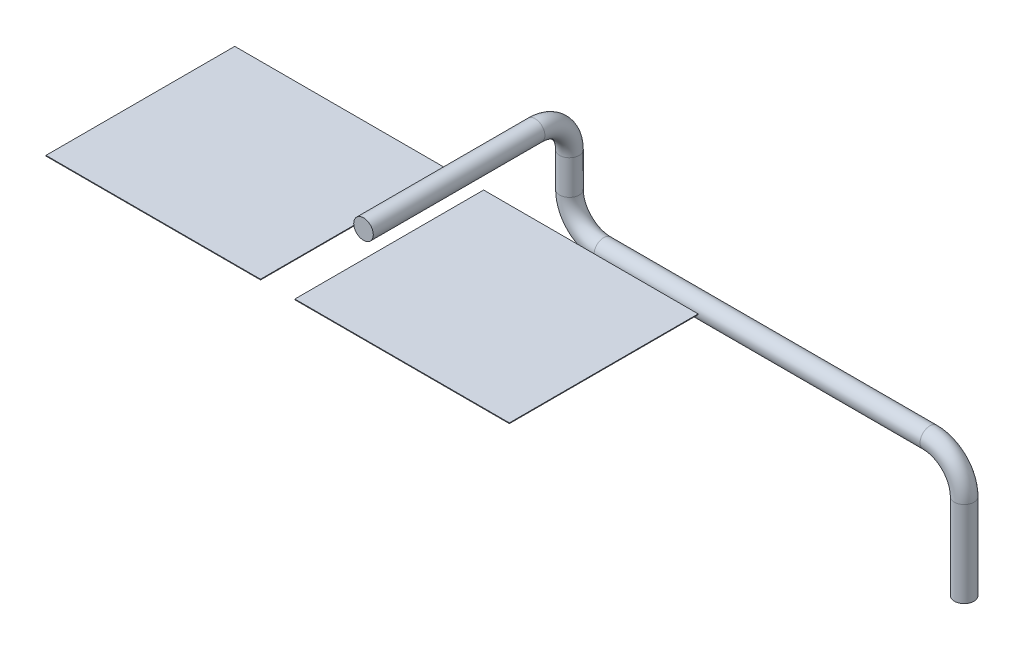
ISO-10303-21;
HEADER;
FILE_DESCRIPTION(('STEP AP214'),'2;1');
FILE_NAME('part.step','',(''),(''),'','','');
FILE_SCHEMA(('AUTOMOTIVE_DESIGN { 1 0 10303 214 1 1 1 1 }'));
ENDSEC;
DATA;
#1=APPLICATION_CONTEXT('core data for automotive mechanical design processes');
#2=APPLICATION_PROTOCOL_DEFINITION('international standard','automotive_design',2000,#1);
#3=PRODUCT_CONTEXT('',#1,'mechanical');
#4=PRODUCT('Part','Part','',(#3));
#5=PRODUCT_RELATED_PRODUCT_CATEGORY('part','',(#4));
#6=PRODUCT_DEFINITION_FORMATION('','',#4);
#7=PRODUCT_DEFINITION_CONTEXT('part definition',#1,'design');
#8=PRODUCT_DEFINITION('design','',#6,#7);
#9=PRODUCT_DEFINITION_SHAPE('','',#8);
#10=(LENGTH_UNIT() NAMED_UNIT(*) SI_UNIT(.MILLI.,.METRE.));
#11=(NAMED_UNIT(*) PLANE_ANGLE_UNIT() SI_UNIT($,.RADIAN.));
#12=(NAMED_UNIT(*) SI_UNIT($,.STERADIAN.) SOLID_ANGLE_UNIT());
#13=UNCERTAINTY_MEASURE_WITH_UNIT(LENGTH_MEASURE(1.E-05),#10,'distance_accuracy_value','');
#14=(GEOMETRIC_REPRESENTATION_CONTEXT(3) GLOBAL_UNCERTAINTY_ASSIGNED_CONTEXT((#13)) GLOBAL_UNIT_ASSIGNED_CONTEXT((#10,
#11,#12)) REPRESENTATION_CONTEXT('',''));
#15=CARTESIAN_POINT('',(0.,0.,0.));
#16=DIRECTION('',(0.,0.,1.));
#17=DIRECTION('',(1.,0.,0.));
#18=AXIS2_PLACEMENT_3D('',#15,#16,#17);
#19=CARTESIAN_POINT('',(13.5,0.57,-5.));
#20=DIRECTION('',(0.,0.,-1.));
#21=DIRECTION('',(-1.,0.,0.));
#22=AXIS2_PLACEMENT_3D('',#19,#20,#21);
#23=CYLINDRICAL_SURFACE('',#22,0.57);
#24=CARTESIAN_POINT('',(13.5,0.57,-5.));
#25=DIRECTION('',(0.,0.,-1.));
#26=DIRECTION('',(-1.,0.,0.));
#27=AXIS2_PLACEMENT_3D('',#24,#25,#26);
#28=CIRCLE('',#27,0.57);
#29=CARTESIAN_POINT('',(12.93,0.57,-5.));
#30=VERTEX_POINT('',#29);
#31=EDGE_CURVE('E12',#30,#30,#28,.T.);
#32=ORIENTED_EDGE('',*,*,#31,.T.);
#33=EDGE_LOOP('',(#32));
#34=FACE_BOUND('',#33,.T.);
#35=CARTESIAN_POINT('',(13.5,0.57,-15.));
#36=DIRECTION('',(0.,0.,-1.));
#37=DIRECTION('',(-1.,0.,0.));
#38=AXIS2_PLACEMENT_3D('',#35,#36,#37);
#39=CIRCLE('',#38,0.57);
#40=CARTESIAN_POINT('',(13.5,1.14,-15.));
#41=VERTEX_POINT('',#40);
#42=EDGE_CURVE('E75',#41,#41,#39,.T.);
#43=ORIENTED_EDGE('',*,*,#42,.F.);
#44=EDGE_LOOP('',(#43));
#45=FACE_BOUND('',#44,.T.);
#46=ADVANCED_FACE('F47',(#34,#45),#23,.T.);
#47=CARTESIAN_POINT('',(13.5,0.57,-5.));
#48=DIRECTION('',(0.,0.,-1.));
#49=DIRECTION('',(-1.,0.,0.));
#50=AXIS2_PLACEMENT_3D('',#47,#48,#49);
#51=PLANE('',#50);
#52=ORIENTED_EDGE('',*,*,#31,.F.);
#53=EDGE_LOOP('',(#52));
#54=FACE_BOUND('',#53,.T.);
#55=ADVANCED_FACE('F82',(#54),#51,.F.);
#56=CARTESIAN_POINT('',(36.5,-12.43,-17.));
#57=DIRECTION('',(0.,-1.,0.));
#58=DIRECTION('',(-1.,0.,0.));
#59=AXIS2_PLACEMENT_3D('',#56,#57,#58);
#60=PLANE('',#59);
#61=CARTESIAN_POINT('',(36.5,-12.43,-17.));
#62=DIRECTION('',(0.,-1.,0.));
#63=DIRECTION('',(-1.,0.,0.));
#64=AXIS2_PLACEMENT_3D('',#61,#62,#63);
#65=CIRCLE('',#64,0.57);
#66=CARTESIAN_POINT('',(35.93,-12.43,-17.));
#67=VERTEX_POINT('',#66);
#68=EDGE_CURVE('E53',#67,#67,#65,.T.);
#69=ORIENTED_EDGE('',*,*,#68,.T.);
#70=EDGE_LOOP('',(#69));
#71=FACE_BOUND('',#70,.T.);
#72=ADVANCED_FACE('F57',(#71),#60,.T.);
#73=CARTESIAN_POINT('',(13.5,-1.43,-15.));
#74=DIRECTION('',(-1.,0.,0.));
#75=DIRECTION('',(0.,0.,1.));
#76=AXIS2_PLACEMENT_3D('',#73,#74,#75);
#77=TOROIDAL_SURFACE('',#76,2.,0.57);
#78=CARTESIAN_POINT('',(13.5,-1.43,-17.));
#79=DIRECTION('',(0.,-1.,0.));
#80=DIRECTION('',(-1.,0.,0.));
#81=AXIS2_PLACEMENT_3D('',#78,#79,#80);
#82=CIRCLE('',#81,0.57);
#83=CARTESIAN_POINT('',(13.5,-1.43,-17.57));
#84=VERTEX_POINT('',#83);
#85=EDGE_CURVE('E72',#84,#84,#82,.T.);
#86=CARTESIAN_POINT('',(13.5,-1.43,-15.));
#87=DIRECTION('',(-1.,0.,0.));
#88=DIRECTION('',(0.,0.,1.));
#89=AXIS2_PLACEMENT_3D('',#86,#87,#88);
#90=CIRCLE('',#89,2.57);
#91=EDGE_CURVE('',#41,#84,#90,.T.);
#92=ORIENTED_EDGE('',*,*,#42,.T.);
#93=ORIENTED_EDGE('',*,*,#85,.F.);
#94=ORIENTED_EDGE('',*,*,#91,.T.);
#95=ORIENTED_EDGE('',*,*,#91,.F.);
#96=EDGE_LOOP('',(#92,#94,#93,#95));
#97=FACE_BOUND('',#96,.T.);
#98=ADVANCED_FACE('F79',(#97),#77,.T.);
#99=CARTESIAN_POINT('',(13.5,-1.43,-17.));
#100=DIRECTION('',(0.,-1.,0.));
#101=DIRECTION('',(0.,0.,-1.));
#102=AXIS2_PLACEMENT_3D('',#99,#100,#101);
#103=CYLINDRICAL_SURFACE('',#102,0.57);
#104=CARTESIAN_POINT('',(13.5,-3.43,-17.));
#105=DIRECTION('',(0.,-1.,0.));
#106=DIRECTION('',(-1.,0.,0.));
#107=AXIS2_PLACEMENT_3D('',#104,#105,#106);
#108=CIRCLE('',#107,0.57);
#109=CARTESIAN_POINT('',(12.93,-3.43,-17.));
#110=VERTEX_POINT('',#109);
#111=EDGE_CURVE('E69',#110,#110,#108,.T.);
#112=ORIENTED_EDGE('',*,*,#111,.F.);
#113=EDGE_LOOP('',(#112));
#114=FACE_BOUND('',#113,.T.);
#115=ORIENTED_EDGE('',*,*,#85,.T.);
#116=EDGE_LOOP('',(#115));
#117=FACE_BOUND('',#116,.T.);
#118=ADVANCED_FACE('F111',(#114,#117),#103,.T.);
#119=CARTESIAN_POINT('',(15.5,-3.43,-17.));
#120=DIRECTION('',(0.,0.,1.));
#121=DIRECTION('',(1.,0.,0.));
#122=AXIS2_PLACEMENT_3D('',#119,#120,#121);
#123=TOROIDAL_SURFACE('',#122,2.,0.57);
#124=CARTESIAN_POINT('',(15.5,-5.43,-17.));
#125=DIRECTION('',(1.,0.,0.));
#126=DIRECTION('',(0.,-1.,0.));
#127=AXIS2_PLACEMENT_3D('',#124,#125,#126);
#128=CIRCLE('',#127,0.57);
#129=CARTESIAN_POINT('',(15.5,-6.,-17.));
#130=VERTEX_POINT('',#129);
#131=EDGE_CURVE('E66',#130,#130,#128,.T.);
#132=CARTESIAN_POINT('',(15.5,-3.43,-17.));
#133=DIRECTION('',(0.,0.,1.));
#134=DIRECTION('',(1.,0.,0.));
#135=AXIS2_PLACEMENT_3D('',#132,#133,#134);
#136=CIRCLE('',#135,2.57);
#137=EDGE_CURVE('',#110,#130,#136,.T.);
#138=ORIENTED_EDGE('',*,*,#111,.T.);
#139=ORIENTED_EDGE('',*,*,#131,.F.);
#140=ORIENTED_EDGE('',*,*,#137,.T.);
#141=ORIENTED_EDGE('',*,*,#137,.F.);
#142=EDGE_LOOP('',(#138,#140,#139,#141));
#143=FACE_BOUND('',#142,.T.);
#144=ADVANCED_FACE('F107',(#143),#123,.T.);
#145=CARTESIAN_POINT('',(15.5,-5.43,-17.));
#146=DIRECTION('',(1.,0.,0.));
#147=DIRECTION('',(0.,0.,-1.));
#148=AXIS2_PLACEMENT_3D('',#145,#146,#147);
#149=CYLINDRICAL_SURFACE('',#148,0.57);
#150=CARTESIAN_POINT('',(34.5,-5.43,-17.));
#151=DIRECTION('',(1.,0.,0.));
#152=DIRECTION('',(0.,-1.,0.));
#153=AXIS2_PLACEMENT_3D('',#150,#151,#152);
#154=CIRCLE('',#153,0.57);
#155=CARTESIAN_POINT('',(34.5,-4.86,-17.));
#156=VERTEX_POINT('',#155);
#157=EDGE_CURVE('E61',#156,#156,#154,.T.);
#158=ORIENTED_EDGE('',*,*,#157,.F.);
#159=EDGE_LOOP('',(#158));
#160=FACE_BOUND('',#159,.T.);
#161=ORIENTED_EDGE('',*,*,#131,.T.);
#162=EDGE_LOOP('',(#161));
#163=FACE_BOUND('',#162,.T.);
#164=ADVANCED_FACE('F100',(#160,#163),#149,.T.);
#165=CARTESIAN_POINT('',(34.5,-7.43,-17.));
#166=DIRECTION('',(0.,0.,-1.));
#167=DIRECTION('',(-1.,0.,0.));
#168=AXIS2_PLACEMENT_3D('',#165,#166,#167);
#169=TOROIDAL_SURFACE('',#168,2.,0.57);
#170=CARTESIAN_POINT('',(36.5,-7.43,-17.));
#171=DIRECTION('',(0.,-1.,0.));
#172=DIRECTION('',(-1.,0.,0.));
#173=AXIS2_PLACEMENT_3D('',#170,#171,#172);
#174=CIRCLE('',#173,0.57);
#175=CARTESIAN_POINT('',(37.07,-7.43,-17.));
#176=VERTEX_POINT('',#175);
#177=EDGE_CURVE('E59',#176,#176,#174,.T.);
#178=CARTESIAN_POINT('',(34.5,-7.43,-17.));
#179=DIRECTION('',(0.,0.,-1.));
#180=DIRECTION('',(-1.,0.,0.));
#181=AXIS2_PLACEMENT_3D('',#178,#179,#180);
#182=CIRCLE('',#181,2.57);
#183=EDGE_CURVE('',#156,#176,#182,.T.);
#184=ORIENTED_EDGE('',*,*,#157,.T.);
#185=ORIENTED_EDGE('',*,*,#177,.F.);
#186=ORIENTED_EDGE('',*,*,#183,.T.);
#187=ORIENTED_EDGE('',*,*,#183,.F.);
#188=EDGE_LOOP('',(#184,#186,#185,#187));
#189=FACE_BOUND('',#188,.T.);
#190=ADVANCED_FACE('F95',(#189),#169,.T.);
#191=CARTESIAN_POINT('',(36.5,-7.43,-17.));
#192=DIRECTION('',(0.,-1.,0.));
#193=DIRECTION('',(0.,0.,-1.));
#194=AXIS2_PLACEMENT_3D('',#191,#192,#193);
#195=CYLINDRICAL_SURFACE('',#194,0.57);
#196=ORIENTED_EDGE('',*,*,#68,.F.);
#197=EDGE_LOOP('',(#196));
#198=FACE_BOUND('',#197,.T.);
#199=ORIENTED_EDGE('',*,*,#177,.T.);
#200=EDGE_LOOP('',(#199));
#201=FACE_BOUND('',#200,.T.);
#202=ADVANCED_FACE('F88',(#198,#201),#195,.T.);
#203=CLOSED_SHELL('',(#46,#55,#72,#98,#118,#144,#164,#190,#202));
#204=MANIFOLD_SOLID_BREP('B2',#203);
#205=CARTESIAN_POINT('',(14.5,0.04,0.));
#206=DIRECTION('',(1.,0.,0.));
#207=DIRECTION('',(0.,0.,-1.));
#208=AXIS2_PLACEMENT_3D('',#205,#206,#207);
#209=PLANE('',#208);
#210=DIRECTION('',(0.,0.,1.));
#211=VECTOR('',#210,1.);
#212=CARTESIAN_POINT('',(14.5,0.,0.));
#213=LINE('',#212,#211);
#214=CARTESIAN_POINT('',(14.5,0.,-11.));
#215=VERTEX_POINT('',#214);
#216=CARTESIAN_POINT('',(14.5,0.,0.));
#217=VERTEX_POINT('',#216);
#218=EDGE_CURVE('E255',#215,#217,#213,.T.);
#219=ORIENTED_EDGE('',*,*,#218,.T.);
#220=DIRECTION('',(0.,-1.,0.));
#221=VECTOR('',#220,1.);
#222=CARTESIAN_POINT('',(14.5,0.04,0.));
#223=LINE('',#222,#221);
#224=CARTESIAN_POINT('',(14.5,0.04,0.));
#225=VERTEX_POINT('',#224);
#226=EDGE_CURVE('E45',#225,#217,#223,.T.);
#227=ORIENTED_EDGE('',*,*,#226,.F.);
#228=DIRECTION('',(0.,0.,1.));
#229=VECTOR('',#228,1.);
#230=CARTESIAN_POINT('',(14.5,0.04,0.));
#231=LINE('',#230,#229);
#232=CARTESIAN_POINT('',(14.5,0.04,-11.));
#233=VERTEX_POINT('',#232);
#234=EDGE_CURVE('E243',#233,#225,#231,.T.);
#235=ORIENTED_EDGE('',*,*,#234,.F.);
#236=DIRECTION('',(0.,-1.,0.));
#237=VECTOR('',#236,1.);
#238=CARTESIAN_POINT('',(14.5,0.04,-11.));
#239=LINE('',#238,#237);
#240=EDGE_CURVE('E251',#233,#215,#239,.T.);
#241=ORIENTED_EDGE('',*,*,#240,.T.);
#242=EDGE_LOOP('',(#219,#227,#235,#241));
#243=FACE_BOUND('',#242,.T.);
#244=ADVANCED_FACE('F192',(#243),#209,.F.);
#245=CARTESIAN_POINT('',(14.5,0.04,0.));
#246=DIRECTION('',(0.,0.,-1.));
#247=DIRECTION('',(-1.,0.,0.));
#248=AXIS2_PLACEMENT_3D('',#245,#246,#247);
#249=PLANE('',#248);
#250=DIRECTION('',(1.,0.,0.));
#251=VECTOR('',#250,1.);
#252=CARTESIAN_POINT('',(14.5,0.,0.));
#253=LINE('',#252,#251);
#254=CARTESIAN_POINT('',(27.,0.,0.));
#255=VERTEX_POINT('',#254);
#256=EDGE_CURVE('E247',#217,#255,#253,.T.);
#257=ORIENTED_EDGE('',*,*,#256,.T.);
#258=DIRECTION('',(0.,-1.,0.));
#259=VECTOR('',#258,1.);
#260=CARTESIAN_POINT('',(27.,0.04,0.));
#261=LINE('',#260,#259);
#262=CARTESIAN_POINT('',(27.,0.04,0.));
#263=VERTEX_POINT('',#262);
#264=EDGE_CURVE('E200',#263,#255,#261,.T.);
#265=ORIENTED_EDGE('',*,*,#264,.F.);
#266=DIRECTION('',(1.,0.,0.));
#267=VECTOR('',#266,1.);
#268=CARTESIAN_POINT('',(14.5,0.04,0.));
#269=LINE('',#268,#267);
#270=EDGE_CURVE('E238',#225,#263,#269,.T.);
#271=ORIENTED_EDGE('',*,*,#270,.F.);
#272=ORIENTED_EDGE('',*,*,#226,.T.);
#273=EDGE_LOOP('',(#257,#265,#271,#272));
#274=FACE_BOUND('',#273,.T.);
#275=ADVANCED_FACE('F246',(#274),#249,.F.);
#276=CARTESIAN_POINT('',(27.,0.04,0.));
#277=DIRECTION('',(-1.,0.,0.));
#278=DIRECTION('',(0.,0.,1.));
#279=AXIS2_PLACEMENT_3D('',#276,#277,#278);
#280=PLANE('',#279);
#281=DIRECTION('',(0.,0.,-1.));
#282=VECTOR('',#281,1.);
#283=CARTESIAN_POINT('',(27.,0.,0.));
#284=LINE('',#283,#282);
#285=CARTESIAN_POINT('',(27.,0.,-11.));
#286=VERTEX_POINT('',#285);
#287=EDGE_CURVE('E225',#255,#286,#284,.T.);
#288=ORIENTED_EDGE('',*,*,#287,.T.);
#289=DIRECTION('',(0.,-1.,0.));
#290=VECTOR('',#289,1.);
#291=CARTESIAN_POINT('',(27.,0.04,-11.));
#292=LINE('',#291,#290);
#293=CARTESIAN_POINT('',(27.,0.04,-11.));
#294=VERTEX_POINT('',#293);
#295=EDGE_CURVE('E248',#294,#286,#292,.T.);
#296=ORIENTED_EDGE('',*,*,#295,.F.);
#297=DIRECTION('',(0.,0.,-1.));
#298=VECTOR('',#297,1.);
#299=CARTESIAN_POINT('',(27.,0.04,0.));
#300=LINE('',#299,#298);
#301=EDGE_CURVE('E241',#263,#294,#300,.T.);
#302=ORIENTED_EDGE('',*,*,#301,.F.);
#303=ORIENTED_EDGE('',*,*,#264,.T.);
#304=EDGE_LOOP('',(#288,#296,#302,#303));
#305=FACE_BOUND('',#304,.T.);
#306=ADVANCED_FACE('F249',(#305),#280,.F.);
#307=CARTESIAN_POINT('',(14.5,0.04,-11.));
#308=DIRECTION('',(0.,0.,1.));
#309=DIRECTION('',(1.,0.,0.));
#310=AXIS2_PLACEMENT_3D('',#307,#308,#309);
#311=PLANE('',#310);
#312=DIRECTION('',(-1.,0.,0.));
#313=VECTOR('',#312,1.);
#314=CARTESIAN_POINT('',(14.5,0.,-11.));
#315=LINE('',#314,#313);
#316=EDGE_CURVE('E231',#286,#215,#315,.T.);
#317=ORIENTED_EDGE('',*,*,#316,.T.);
#318=ORIENTED_EDGE('',*,*,#240,.F.);
#319=DIRECTION('',(-1.,0.,0.));
#320=VECTOR('',#319,1.);
#321=CARTESIAN_POINT('',(14.5,0.04,-11.));
#322=LINE('',#321,#320);
#323=EDGE_CURVE('E208',#294,#233,#322,.T.);
#324=ORIENTED_EDGE('',*,*,#323,.F.);
#325=ORIENTED_EDGE('',*,*,#295,.T.);
#326=EDGE_LOOP('',(#317,#318,#324,#325));
#327=FACE_BOUND('',#326,.T.);
#328=ADVANCED_FACE('F262',(#327),#311,.F.);
#329=CARTESIAN_POINT('',(0.,0.04,0.));
#330=DIRECTION('',(0.,-1.,0.));
#331=DIRECTION('',(0.,0.,-1.));
#332=AXIS2_PLACEMENT_3D('',#329,#330,#331);
#333=PLANE('',#332);
#334=ORIENTED_EDGE('',*,*,#234,.T.);
#335=ORIENTED_EDGE('',*,*,#270,.T.);
#336=ORIENTED_EDGE('',*,*,#301,.T.);
#337=ORIENTED_EDGE('',*,*,#323,.T.);
#338=EDGE_LOOP('',(#334,#335,#336,#337));
#339=FACE_BOUND('',#338,.T.);
#340=ADVANCED_FACE('F239',(#339),#333,.F.);
#341=CARTESIAN_POINT('',(0.,0.,0.));
#342=DIRECTION('',(0.,-1.,0.));
#343=DIRECTION('',(0.,0.,-1.));
#344=AXIS2_PLACEMENT_3D('',#341,#342,#343);
#345=PLANE('',#344);
#346=ORIENTED_EDGE('',*,*,#218,.F.);
#347=ORIENTED_EDGE('',*,*,#316,.F.);
#348=ORIENTED_EDGE('',*,*,#287,.F.);
#349=ORIENTED_EDGE('',*,*,#256,.F.);
#350=EDGE_LOOP('',(#346,#347,#348,#349));
#351=FACE_BOUND('',#350,.T.);
#352=ADVANCED_FACE('F265',(#351),#345,.T.);
#353=CLOSED_SHELL('',(#244,#275,#306,#328,#340,#352));
#354=MANIFOLD_SOLID_BREP('B6',#353);
#355=CARTESIAN_POINT('',(0.,0.04,0.));
#356=DIRECTION('',(1.,0.,0.));
#357=DIRECTION('',(0.,0.,-1.));
#358=AXIS2_PLACEMENT_3D('',#355,#356,#357);
#359=PLANE('',#358);
#360=DIRECTION('',(0.,0.,1.));
#361=VECTOR('',#360,1.);
#362=CARTESIAN_POINT('',(0.,0.,0.));
#363=LINE('',#362,#361);
#364=CARTESIAN_POINT('',(0.,0.,-11.));
#365=VERTEX_POINT('',#364);
#366=CARTESIAN_POINT('',(0.,0.,0.));
#367=VERTEX_POINT('',#366);
#368=EDGE_CURVE('E378',#365,#367,#363,.T.);
#369=ORIENTED_EDGE('',*,*,#368,.T.);
#370=DIRECTION('',(0.,-1.,0.));
#371=VECTOR('',#370,1.);
#372=CARTESIAN_POINT('',(0.,0.04,0.));
#373=LINE('',#372,#371);
#374=CARTESIAN_POINT('',(0.,0.04,0.));
#375=VERTEX_POINT('',#374);
#376=EDGE_CURVE('E190',#375,#367,#373,.T.);
#377=ORIENTED_EDGE('',*,*,#376,.F.);
#378=DIRECTION('',(0.,0.,1.));
#379=VECTOR('',#378,1.);
#380=CARTESIAN_POINT('',(0.,0.04,0.));
#381=LINE('',#380,#379);
#382=CARTESIAN_POINT('',(0.,0.04,-11.));
#383=VERTEX_POINT('',#382);
#384=EDGE_CURVE('E366',#383,#375,#381,.T.);
#385=ORIENTED_EDGE('',*,*,#384,.F.);
#386=DIRECTION('',(0.,-1.,0.));
#387=VECTOR('',#386,1.);
#388=CARTESIAN_POINT('',(0.,0.04,-11.));
#389=LINE('',#388,#387);
#390=EDGE_CURVE('E374',#383,#365,#389,.T.);
#391=ORIENTED_EDGE('',*,*,#390,.T.);
#392=EDGE_LOOP('',(#369,#377,#385,#391));
#393=FACE_BOUND('',#392,.T.);
#394=ADVANCED_FACE('F315',(#393),#359,.F.);
#395=CARTESIAN_POINT('',(0.,0.04,0.));
#396=DIRECTION('',(0.,0.,-1.));
#397=DIRECTION('',(-1.,0.,0.));
#398=AXIS2_PLACEMENT_3D('',#395,#396,#397);
#399=PLANE('',#398);
#400=DIRECTION('',(1.,0.,0.));
#401=VECTOR('',#400,1.);
#402=CARTESIAN_POINT('',(0.,0.,0.));
#403=LINE('',#402,#401);
#404=CARTESIAN_POINT('',(12.5,0.,0.));
#405=VERTEX_POINT('',#404);
#406=EDGE_CURVE('E370',#367,#405,#403,.T.);
#407=ORIENTED_EDGE('',*,*,#406,.T.);
#408=DIRECTION('',(0.,-1.,0.));
#409=VECTOR('',#408,1.);
#410=CARTESIAN_POINT('',(12.5,0.04,0.));
#411=LINE('',#410,#409);
#412=CARTESIAN_POINT('',(12.5,0.04,0.));
#413=VERTEX_POINT('',#412);
#414=EDGE_CURVE('E323',#413,#405,#411,.T.);
#415=ORIENTED_EDGE('',*,*,#414,.F.);
#416=DIRECTION('',(1.,0.,0.));
#417=VECTOR('',#416,1.);
#418=CARTESIAN_POINT('',(0.,0.04,0.));
#419=LINE('',#418,#417);
#420=EDGE_CURVE('E361',#375,#413,#419,.T.);
#421=ORIENTED_EDGE('',*,*,#420,.F.);
#422=ORIENTED_EDGE('',*,*,#376,.T.);
#423=EDGE_LOOP('',(#407,#415,#421,#422));
#424=FACE_BOUND('',#423,.T.);
#425=ADVANCED_FACE('F369',(#424),#399,.F.);
#426=CARTESIAN_POINT('',(12.5,0.04,0.));
#427=DIRECTION('',(-1.,0.,0.));
#428=DIRECTION('',(0.,0.,1.));
#429=AXIS2_PLACEMENT_3D('',#426,#427,#428);
#430=PLANE('',#429);
#431=DIRECTION('',(0.,0.,-1.));
#432=VECTOR('',#431,1.);
#433=CARTESIAN_POINT('',(12.5,0.,0.));
#434=LINE('',#433,#432);
#435=CARTESIAN_POINT('',(12.5,0.,-11.));
#436=VERTEX_POINT('',#435);
#437=EDGE_CURVE('E348',#405,#436,#434,.T.);
#438=ORIENTED_EDGE('',*,*,#437,.T.);
#439=DIRECTION('',(0.,-1.,0.));
#440=VECTOR('',#439,1.);
#441=CARTESIAN_POINT('',(12.5,0.04,-11.));
#442=LINE('',#441,#440);
#443=CARTESIAN_POINT('',(12.5,0.04,-11.));
#444=VERTEX_POINT('',#443);
#445=EDGE_CURVE('E371',#444,#436,#442,.T.);
#446=ORIENTED_EDGE('',*,*,#445,.F.);
#447=DIRECTION('',(0.,0.,-1.));
#448=VECTOR('',#447,1.);
#449=CARTESIAN_POINT('',(12.5,0.04,0.));
#450=LINE('',#449,#448);
#451=EDGE_CURVE('E364',#413,#444,#450,.T.);
#452=ORIENTED_EDGE('',*,*,#451,.F.);
#453=ORIENTED_EDGE('',*,*,#414,.T.);
#454=EDGE_LOOP('',(#438,#446,#452,#453));
#455=FACE_BOUND('',#454,.T.);
#456=ADVANCED_FACE('F372',(#455),#430,.F.);
#457=CARTESIAN_POINT('',(0.,0.04,-11.));
#458=DIRECTION('',(0.,0.,1.));
#459=DIRECTION('',(1.,0.,0.));
#460=AXIS2_PLACEMENT_3D('',#457,#458,#459);
#461=PLANE('',#460);
#462=DIRECTION('',(-1.,0.,0.));
#463=VECTOR('',#462,1.);
#464=CARTESIAN_POINT('',(0.,0.,-11.));
#465=LINE('',#464,#463);
#466=EDGE_CURVE('E354',#436,#365,#465,.T.);
#467=ORIENTED_EDGE('',*,*,#466,.T.);
#468=ORIENTED_EDGE('',*,*,#390,.F.);
#469=DIRECTION('',(-1.,0.,0.));
#470=VECTOR('',#469,1.);
#471=CARTESIAN_POINT('',(0.,0.04,-11.));
#472=LINE('',#471,#470);
#473=EDGE_CURVE('E331',#444,#383,#472,.T.);
#474=ORIENTED_EDGE('',*,*,#473,.F.);
#475=ORIENTED_EDGE('',*,*,#445,.T.);
#476=EDGE_LOOP('',(#467,#468,#474,#475));
#477=FACE_BOUND('',#476,.T.);
#478=ADVANCED_FACE('F385',(#477),#461,.F.);
#479=CARTESIAN_POINT('',(0.,0.04,0.));
#480=DIRECTION('',(0.,-1.,0.));
#481=DIRECTION('',(0.,0.,-1.));
#482=AXIS2_PLACEMENT_3D('',#479,#480,#481);
#483=PLANE('',#482);
#484=ORIENTED_EDGE('',*,*,#384,.T.);
#485=ORIENTED_EDGE('',*,*,#420,.T.);
#486=ORIENTED_EDGE('',*,*,#451,.T.);
#487=ORIENTED_EDGE('',*,*,#473,.T.);
#488=EDGE_LOOP('',(#484,#485,#486,#487));
#489=FACE_BOUND('',#488,.T.);
#490=ADVANCED_FACE('F362',(#489),#483,.F.);
#491=CARTESIAN_POINT('',(0.,0.,0.));
#492=DIRECTION('',(0.,-1.,0.));
#493=DIRECTION('',(0.,0.,-1.));
#494=AXIS2_PLACEMENT_3D('',#491,#492,#493);
#495=PLANE('',#494);
#496=ORIENTED_EDGE('',*,*,#368,.F.);
#497=ORIENTED_EDGE('',*,*,#466,.F.);
#498=ORIENTED_EDGE('',*,*,#437,.F.);
#499=ORIENTED_EDGE('',*,*,#406,.F.);
#500=EDGE_LOOP('',(#496,#497,#498,#499));
#501=FACE_BOUND('',#500,.T.);
#502=ADVANCED_FACE('F388',(#501),#495,.T.);
#503=CLOSED_SHELL('',(#394,#425,#456,#478,#490,#502));
#504=MANIFOLD_SOLID_BREP('B39',#503);
#505=ADVANCED_BREP_SHAPE_REPRESENTATION('',(#18,#204,#354,#504),#14);
#506=SHAPE_DEFINITION_REPRESENTATION(#9,#505);
ENDSEC;
END-ISO-10303-21;
